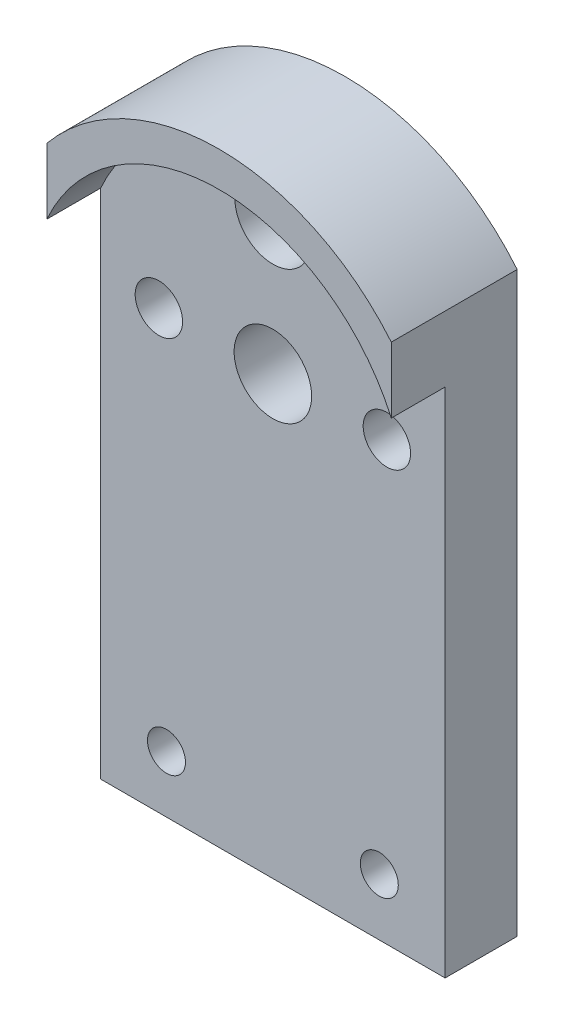
ISO-10303-21;
HEADER;
FILE_DESCRIPTION(('STEP AP214'),'2;1');
FILE_NAME('part.step','',(''),(''),'','','');
FILE_SCHEMA(('AUTOMOTIVE_DESIGN { 1 0 10303 214 1 1 1 1 }'));
ENDSEC;
DATA;
#1=APPLICATION_CONTEXT('core data for automotive mechanical design processes');
#2=APPLICATION_PROTOCOL_DEFINITION('international standard','automotive_design',2000,#1);
#3=PRODUCT_CONTEXT('',#1,'mechanical');
#4=PRODUCT('Part','Part','',(#3));
#5=PRODUCT_RELATED_PRODUCT_CATEGORY('part','',(#4));
#6=PRODUCT_DEFINITION_FORMATION('','',#4);
#7=PRODUCT_DEFINITION_CONTEXT('part definition',#1,'design');
#8=PRODUCT_DEFINITION('design','',#6,#7);
#9=PRODUCT_DEFINITION_SHAPE('','',#8);
#10=(LENGTH_UNIT() NAMED_UNIT(*) SI_UNIT(.MILLI.,.METRE.));
#11=(NAMED_UNIT(*) PLANE_ANGLE_UNIT() SI_UNIT($,.RADIAN.));
#12=(NAMED_UNIT(*) SI_UNIT($,.STERADIAN.) SOLID_ANGLE_UNIT());
#13=UNCERTAINTY_MEASURE_WITH_UNIT(LENGTH_MEASURE(1.E-05),#10,'distance_accuracy_value','');
#14=(GEOMETRIC_REPRESENTATION_CONTEXT(3) GLOBAL_UNCERTAINTY_ASSIGNED_CONTEXT((#13)) GLOBAL_UNIT_ASSIGNED_CONTEXT((#10,
#11,#12)) REPRESENTATION_CONTEXT('',''));
#15=CARTESIAN_POINT('',(0.,0.,0.));
#16=DIRECTION('',(0.,0.,1.));
#17=DIRECTION('',(1.,0.,0.));
#18=AXIS2_PLACEMENT_3D('',#15,#16,#17);
#19=CARTESIAN_POINT('',(9.525,0.,0.));
#20=DIRECTION('',(0.,0.,1.));
#21=DIRECTION('',(1.,0.,0.));
#22=AXIS2_PLACEMENT_3D('',#19,#20,#21);
#23=CYLINDRICAL_SURFACE('',#22,1.9812);
#24=CARTESIAN_POINT('',(9.525,0.,6.0198));
#25=DIRECTION('',(0.,0.,1.));
#26=DIRECTION('',(1.,0.,0.));
#27=AXIS2_PLACEMENT_3D('',#24,#25,#26);
#28=CIRCLE('',#27,1.9812);
#29=CARTESIAN_POINT('',(11.5062,0.,6.0198));
#30=VERTEX_POINT('',#29);
#31=EDGE_CURVE('E326',#30,#30,#28,.T.);
#32=ORIENTED_EDGE('',*,*,#31,.T.);
#33=EDGE_LOOP('',(#32));
#34=FACE_BOUND('',#33,.T.);
#35=CARTESIAN_POINT('',(9.525,0.,2.8448));
#36=DIRECTION('',(0.,0.,-1.));
#37=DIRECTION('',(-1.,0.,0.));
#38=AXIS2_PLACEMENT_3D('',#35,#36,#37);
#39=CIRCLE('',#38,1.9812);
#40=CARTESIAN_POINT('',(7.5438,0.,2.8448));
#41=VERTEX_POINT('',#40);
#42=EDGE_CURVE('E55',#41,#41,#39,.F.);
#43=ORIENTED_EDGE('',*,*,#42,.F.);
#44=EDGE_LOOP('',(#43));
#45=FACE_BOUND('',#44,.T.);
#46=ADVANCED_FACE('F51',(#34,#45),#23,.F.);
#47=CARTESIAN_POINT('',(-9.525,0.,0.));
#48=DIRECTION('',(0.,0.,1.));
#49=DIRECTION('',(1.,0.,0.));
#50=AXIS2_PLACEMENT_3D('',#47,#48,#49);
#51=CYLINDRICAL_SURFACE('',#50,1.9812);
#52=CARTESIAN_POINT('',(-9.525,0.,6.0198));
#53=DIRECTION('',(0.,0.,1.));
#54=DIRECTION('',(1.,0.,0.));
#55=AXIS2_PLACEMENT_3D('',#52,#53,#54);
#56=CIRCLE('',#55,1.9812);
#57=CARTESIAN_POINT('',(-7.5438,0.,6.0198));
#58=VERTEX_POINT('',#57);
#59=EDGE_CURVE('E321',#58,#58,#56,.T.);
#60=ORIENTED_EDGE('',*,*,#59,.T.);
#61=EDGE_LOOP('',(#60));
#62=FACE_BOUND('',#61,.T.);
#63=CARTESIAN_POINT('',(-9.525,0.,2.8448));
#64=DIRECTION('',(0.,0.,-1.));
#65=DIRECTION('',(-1.,0.,0.));
#66=AXIS2_PLACEMENT_3D('',#63,#64,#65);
#67=CIRCLE('',#66,1.9812);
#68=CARTESIAN_POINT('',(-11.5062,0.,2.8448));
#69=VERTEX_POINT('',#68);
#70=EDGE_CURVE('E245',#69,#69,#67,.F.);
#71=ORIENTED_EDGE('',*,*,#70,.F.);
#72=EDGE_LOOP('',(#71));
#73=FACE_BOUND('',#72,.T.);
#74=ADVANCED_FACE('F406',(#62,#73),#51,.F.);
#75=CARTESIAN_POINT('',(0.,-0.1524,6.0198));
#76=DIRECTION('',(0.,0.,-1.));
#77=DIRECTION('',(-1.,0.,0.));
#78=AXIS2_PLACEMENT_3D('',#75,#76,#77);
#79=PLANE('',#78);
#80=CARTESIAN_POINT('',(0.,11.1125,6.0198));
#81=DIRECTION('',(0.,0.,-1.));
#82=DIRECTION('',(-1.,0.,0.));
#83=AXIS2_PLACEMENT_3D('',#80,#81,#82);
#84=CIRCLE('',#83,3.175);
#85=CARTESIAN_POINT('',(-3.175,11.1125,6.0198));
#86=VERTEX_POINT('',#85);
#87=EDGE_CURVE('E678',#86,#86,#84,.T.);
#88=ORIENTED_EDGE('',*,*,#87,.T.);
#89=EDGE_LOOP('',(#88));
#90=FACE_BOUND('',#89,.T.);
#91=CARTESIAN_POINT('',(8.89,-31.75,6.0198));
#92=DIRECTION('',(0.,0.,1.));
#93=DIRECTION('',(1.,0.,0.));
#94=AXIS2_PLACEMENT_3D('',#91,#92,#93);
#95=CIRCLE('',#94,1.5875);
#96=CARTESIAN_POINT('',(10.4775,-31.75,6.0198));
#97=VERTEX_POINT('',#96);
#98=EDGE_CURVE('E695',#97,#97,#95,.T.);
#99=ORIENTED_EDGE('',*,*,#98,.F.);
#100=EDGE_LOOP('',(#99));
#101=FACE_BOUND('',#100,.T.);
#102=CARTESIAN_POINT('',(-8.88999999999999,-31.75,6.0198));
#103=DIRECTION('',(0.,0.,1.));
#104=DIRECTION('',(1.,0.,0.));
#105=AXIS2_PLACEMENT_3D('',#102,#103,#104);
#106=CIRCLE('',#105,1.5875);
#107=CARTESIAN_POINT('',(-7.30249999999999,-31.75,6.0198));
#108=VERTEX_POINT('',#107);
#109=EDGE_CURVE('E211',#108,#108,#106,.T.);
#110=ORIENTED_EDGE('',*,*,#109,.F.);
#111=EDGE_LOOP('',(#110));
#112=FACE_BOUND('',#111,.T.);
#113=ORIENTED_EDGE('',*,*,#59,.F.);
#114=EDGE_LOOP('',(#113));
#115=FACE_BOUND('',#114,.T.);
#116=ORIENTED_EDGE('',*,*,#31,.F.);
#117=EDGE_LOOP('',(#116));
#118=FACE_BOUND('',#117,.T.);
#119=CARTESIAN_POINT('',(0.,0.,6.0198));
#120=DIRECTION('',(0.,0.,1.));
#121=DIRECTION('',(1.,0.,0.));
#122=AXIS2_PLACEMENT_3D('',#119,#120,#121);
#123=CIRCLE('',#122,3.2385);
#124=CARTESIAN_POINT('',(3.2385,0.,6.0198));
#125=VERTEX_POINT('',#124);
#126=EDGE_CURVE('E357',#125,#125,#123,.T.);
#127=ORIENTED_EDGE('',*,*,#126,.F.);
#128=EDGE_LOOP('',(#127));
#129=FACE_BOUND('',#128,.T.);
#130=CARTESIAN_POINT('',(0.,-0.1524,6.0198));
#131=DIRECTION('',(0.,0.,-1.));
#132=DIRECTION('',(-1.,0.,0.));
#133=AXIS2_PLACEMENT_3D('',#130,#131,#132);
#134=CIRCLE('',#133,15.748);
#135=CARTESIAN_POINT('',(-14.3891,6.24707694659492,6.0198));
#136=VERTEX_POINT('',#135);
#137=CARTESIAN_POINT('',(14.3891,6.24707694659492,6.0198));
#138=VERTEX_POINT('',#137);
#139=EDGE_CURVE('E325',#136,#138,#134,.T.);
#140=ORIENTED_EDGE('',*,*,#139,.F.);
#141=DIRECTION('',(0.,-1.,0.));
#142=VECTOR('',#141,1.);
#143=CARTESIAN_POINT('',(-14.3891,-36.5125,6.0198));
#144=LINE('',#143,#142);
#145=CARTESIAN_POINT('',(-14.3891,-36.5125,6.0198));
#146=VERTEX_POINT('',#145);
#147=EDGE_CURVE('E368',#136,#146,#144,.T.);
#148=ORIENTED_EDGE('',*,*,#147,.T.);
#149=DIRECTION('',(1.,0.,0.));
#150=VECTOR('',#149,1.);
#151=CARTESIAN_POINT('',(14.3891,-36.5125,6.0198));
#152=LINE('',#151,#150);
#153=CARTESIAN_POINT('',(14.3891,-36.5125,6.0198));
#154=VERTEX_POINT('',#153);
#155=EDGE_CURVE('E372',#146,#154,#152,.T.);
#156=ORIENTED_EDGE('',*,*,#155,.T.);
#157=DIRECTION('',(0.,1.,0.));
#158=VECTOR('',#157,1.);
#159=CARTESIAN_POINT('',(14.3891,-36.5125,6.0198));
#160=LINE('',#159,#158);
#161=EDGE_CURVE('E365',#154,#138,#160,.T.);
#162=ORIENTED_EDGE('',*,*,#161,.T.);
#163=EDGE_LOOP('',(#140,#148,#156,#162));
#164=FACE_BOUND('',#163,.T.);
#165=ADVANCED_FACE('F412',(#90,#101,#112,#115,#118,#129,#164),#79,.F.);
#166=CARTESIAN_POINT('',(0.,-0.1524,0.));
#167=DIRECTION('',(0.,0.,-1.));
#168=DIRECTION('',(-1.,0.,0.));
#169=AXIS2_PLACEMENT_3D('',#166,#167,#168);
#170=PLANE('',#169);
#171=CARTESIAN_POINT('',(0.,11.1125,0.));
#172=DIRECTION('',(0.,0.,-1.));
#173=DIRECTION('',(-1.,0.,0.));
#174=AXIS2_PLACEMENT_3D('',#171,#172,#173);
#175=CIRCLE('',#174,3.175);
#176=CARTESIAN_POINT('',(-3.175,11.1125,0.));
#177=VERTEX_POINT('',#176);
#178=EDGE_CURVE('E675',#177,#177,#175,.T.);
#179=ORIENTED_EDGE('',*,*,#178,.F.);
#180=EDGE_LOOP('',(#179));
#181=FACE_BOUND('',#180,.T.);
#182=CARTESIAN_POINT('',(0.,-15.875,0.));
#183=DIRECTION('',(0.,0.,-1.));
#184=DIRECTION('',(-1.,0.,0.));
#185=AXIS2_PLACEMENT_3D('',#182,#183,#184);
#186=CIRCLE('',#185,3.96875);
#187=CARTESIAN_POINT('',(-3.96875,-15.875,0.));
#188=VERTEX_POINT('',#187);
#189=EDGE_CURVE('E680',#188,#188,#186,.T.);
#190=ORIENTED_EDGE('',*,*,#189,.F.);
#191=EDGE_LOOP('',(#190));
#192=FACE_BOUND('',#191,.T.);
#193=CARTESIAN_POINT('',(8.89,-31.75,0.));
#194=DIRECTION('',(0.,0.,1.));
#195=DIRECTION('',(1.,0.,0.));
#196=AXIS2_PLACEMENT_3D('',#193,#194,#195);
#197=CIRCLE('',#196,1.5875);
#198=CARTESIAN_POINT('',(10.4775,-31.75,0.));
#199=VERTEX_POINT('',#198);
#200=EDGE_CURVE('E286',#199,#199,#197,.T.);
#201=ORIENTED_EDGE('',*,*,#200,.T.);
#202=EDGE_LOOP('',(#201));
#203=FACE_BOUND('',#202,.T.);
#204=CARTESIAN_POINT('',(-8.88999999999999,-31.75,0.));
#205=DIRECTION('',(0.,0.,1.));
#206=DIRECTION('',(1.,0.,0.));
#207=AXIS2_PLACEMENT_3D('',#204,#205,#206);
#208=CIRCLE('',#207,1.5875);
#209=CARTESIAN_POINT('',(-7.30249999999999,-31.75,0.));
#210=VERTEX_POINT('',#209);
#211=EDGE_CURVE('E698',#210,#210,#208,.T.);
#212=ORIENTED_EDGE('',*,*,#211,.T.);
#213=EDGE_LOOP('',(#212));
#214=FACE_BOUND('',#213,.T.);
#215=DIRECTION('',(-0.866025403784438,-0.5,0.));
#216=VECTOR('',#215,1.);
#217=CARTESIAN_POINT('',(-6.604,-1.6864401363029,0.));
#218=LINE('',#217,#216);
#219=CARTESIAN_POINT('',(-6.604,-1.6864401363029,0.));
#220=VERTEX_POINT('',#219);
#221=CARTESIAN_POINT('',(-9.525,-3.3728802726058,0.));
#222=VERTEX_POINT('',#221);
#223=EDGE_CURVE('E69',#220,#222,#218,.T.);
#224=ORIENTED_EDGE('',*,*,#223,.F.);
#225=DIRECTION('',(0.,-1.,0.));
#226=VECTOR('',#225,1.);
#227=CARTESIAN_POINT('',(-6.604,1.68644013630289,0.));
#228=LINE('',#227,#226);
#229=CARTESIAN_POINT('',(-6.604,1.68644013630289,0.));
#230=VERTEX_POINT('',#229);
#231=EDGE_CURVE('E204',#230,#220,#228,.T.);
#232=ORIENTED_EDGE('',*,*,#231,.F.);
#233=DIRECTION('',(0.866025403784438,-0.5,0.));
#234=VECTOR('',#233,1.);
#235=CARTESIAN_POINT('',(-9.525,3.37288027260579,0.));
#236=LINE('',#235,#234);
#237=CARTESIAN_POINT('',(-9.525,3.37288027260579,0.));
#238=VERTEX_POINT('',#237);
#239=EDGE_CURVE('E208',#238,#230,#236,.T.);
#240=ORIENTED_EDGE('',*,*,#239,.F.);
#241=DIRECTION('',(0.866025403784439,0.5,0.));
#242=VECTOR('',#241,1.);
#243=CARTESIAN_POINT('',(-12.446,1.6864401363029,0.));
#244=LINE('',#243,#242);
#245=CARTESIAN_POINT('',(-12.446,1.6864401363029,0.));
#246=VERTEX_POINT('',#245);
#247=EDGE_CURVE('E235',#246,#238,#244,.T.);
#248=ORIENTED_EDGE('',*,*,#247,.F.);
#249=DIRECTION('',(0.,1.,0.));
#250=VECTOR('',#249,1.);
#251=CARTESIAN_POINT('',(-12.446,-1.6864401363029,0.));
#252=LINE('',#251,#250);
#253=CARTESIAN_POINT('',(-12.446,-1.6864401363029,0.));
#254=VERTEX_POINT('',#253);
#255=EDGE_CURVE('E231',#254,#246,#252,.T.);
#256=ORIENTED_EDGE('',*,*,#255,.F.);
#257=DIRECTION('',(-0.866025403784438,0.5,0.));
#258=VECTOR('',#257,1.);
#259=CARTESIAN_POINT('',(-9.525,-3.3728802726058,0.));
#260=LINE('',#259,#258);
#261=EDGE_CURVE('E227',#222,#254,#260,.T.);
#262=ORIENTED_EDGE('',*,*,#261,.F.);
#263=EDGE_LOOP('',(#224,#232,#240,#248,#256,#262));
#264=FACE_BOUND('',#263,.T.);
#265=DIRECTION('',(-0.866025403784439,0.5,0.));
#266=VECTOR('',#265,1.);
#267=CARTESIAN_POINT('',(9.52499999999999,-3.37288027260579,0.));
#268=LINE('',#267,#266);
#269=CARTESIAN_POINT('',(9.52499999999999,-3.37288027260579,0.));
#270=VERTEX_POINT('',#269);
#271=CARTESIAN_POINT('',(6.604,-1.6864401363029,0.));
#272=VERTEX_POINT('',#271);
#273=EDGE_CURVE('E77',#270,#272,#268,.T.);
#274=ORIENTED_EDGE('',*,*,#273,.F.);
#275=DIRECTION('',(-0.866025403784438,-0.5,0.));
#276=VECTOR('',#275,1.);
#277=CARTESIAN_POINT('',(12.446,-1.68644013630289,0.));
#278=LINE('',#277,#276);
#279=CARTESIAN_POINT('',(12.446,-1.68644013630289,0.));
#280=VERTEX_POINT('',#279);
#281=EDGE_CURVE('E262',#280,#270,#278,.T.);
#282=ORIENTED_EDGE('',*,*,#281,.F.);
#283=DIRECTION('',(0.,-1.,0.));
#284=VECTOR('',#283,1.);
#285=CARTESIAN_POINT('',(12.446,1.6864401363029,0.));
#286=LINE('',#285,#284);
#287=CARTESIAN_POINT('',(12.446,1.6864401363029,0.));
#288=VERTEX_POINT('',#287);
#289=EDGE_CURVE('E298',#288,#280,#286,.T.);
#290=ORIENTED_EDGE('',*,*,#289,.F.);
#291=DIRECTION('',(0.866025403784439,-0.5,0.));
#292=VECTOR('',#291,1.);
#293=CARTESIAN_POINT('',(9.525,3.37288027260579,0.));
#294=LINE('',#293,#292);
#295=CARTESIAN_POINT('',(9.525,3.37288027260579,0.));
#296=VERTEX_POINT('',#295);
#297=EDGE_CURVE('E294',#296,#288,#294,.T.);
#298=ORIENTED_EDGE('',*,*,#297,.F.);
#299=DIRECTION('',(0.866025403784439,0.5,0.));
#300=VECTOR('',#299,1.);
#301=CARTESIAN_POINT('',(6.604,1.6864401363029,0.));
#302=LINE('',#301,#300);
#303=CARTESIAN_POINT('',(6.604,1.6864401363029,0.));
#304=VERTEX_POINT('',#303);
#305=EDGE_CURVE('E290',#304,#296,#302,.T.);
#306=ORIENTED_EDGE('',*,*,#305,.F.);
#307=DIRECTION('',(0.,1.,0.));
#308=VECTOR('',#307,1.);
#309=CARTESIAN_POINT('',(6.604,-1.6864401363029,0.));
#310=LINE('',#309,#308);
#311=EDGE_CURVE('E285',#272,#304,#310,.T.);
#312=ORIENTED_EDGE('',*,*,#311,.F.);
#313=EDGE_LOOP('',(#274,#282,#290,#298,#306,#312));
#314=FACE_BOUND('',#313,.T.);
#315=DIRECTION('',(0.,1.,0.));
#316=VECTOR('',#315,1.);
#317=CARTESIAN_POINT('',(14.3891,-36.5125,0.));
#318=LINE('',#317,#316);
#319=CARTESIAN_POINT('',(14.3891,-36.5125,0.));
#320=VERTEX_POINT('',#319);
#321=CARTESIAN_POINT('',(14.3891,11.742361964411,0.));
#322=VERTEX_POINT('',#321);
#323=EDGE_CURVE('E361',#320,#322,#318,.T.);
#324=ORIENTED_EDGE('',*,*,#323,.F.);
#325=DIRECTION('',(1.,0.,0.));
#326=VECTOR('',#325,1.);
#327=CARTESIAN_POINT('',(14.3891,-36.5125,0.));
#328=LINE('',#327,#326);
#329=CARTESIAN_POINT('',(-14.3891,-36.5125,0.));
#330=VERTEX_POINT('',#329);
#331=EDGE_CURVE('E369',#330,#320,#328,.T.);
#332=ORIENTED_EDGE('',*,*,#331,.F.);
#333=DIRECTION('',(0.,-1.,0.));
#334=VECTOR('',#333,1.);
#335=CARTESIAN_POINT('',(-14.3891,-36.5125,0.));
#336=LINE('',#335,#334);
#337=CARTESIAN_POINT('',(-14.3891,11.742361964411,0.));
#338=VERTEX_POINT('',#337);
#339=EDGE_CURVE('E382',#338,#330,#336,.T.);
#340=ORIENTED_EDGE('',*,*,#339,.F.);
#341=CARTESIAN_POINT('',(0.,-0.1524,0.));
#342=DIRECTION('',(0.,0.,1.));
#343=DIRECTION('',(-1.,0.,0.));
#344=AXIS2_PLACEMENT_3D('',#341,#342,#343);
#345=CIRCLE('',#344,18.669);
#346=EDGE_CURVE('E379',#322,#338,#345,.T.);
#347=ORIENTED_EDGE('',*,*,#346,.F.);
#348=EDGE_LOOP('',(#324,#332,#340,#347));
#349=FACE_BOUND('',#348,.T.);
#350=CARTESIAN_POINT('',(0.,0.,0.));
#351=DIRECTION('',(0.,0.,1.));
#352=DIRECTION('',(1.,0.,0.));
#353=AXIS2_PLACEMENT_3D('',#350,#351,#352);
#354=CIRCLE('',#353,3.2385);
#355=CARTESIAN_POINT('',(3.2385,0.,0.));
#356=VERTEX_POINT('',#355);
#357=EDGE_CURVE('E356',#356,#356,#354,.T.);
#358=ORIENTED_EDGE('',*,*,#357,.T.);
#359=EDGE_LOOP('',(#358));
#360=FACE_BOUND('',#359,.T.);
#361=ADVANCED_FACE('F432',(#181,#192,#203,#214,#264,#314,#349,#360),#170,.T.);
#362=CARTESIAN_POINT('',(14.3891,-36.5125,6.0198));
#363=DIRECTION('',(-1.,0.,0.));
#364=DIRECTION('',(0.,-1.,0.));
#365=AXIS2_PLACEMENT_3D('',#362,#363,#364);
#366=PLANE('',#365);
#367=ORIENTED_EDGE('',*,*,#323,.T.);
#368=DIRECTION('',(0.,0.,-1.));
#369=VECTOR('',#368,1.);
#370=CARTESIAN_POINT('',(14.3891,11.742361964411,6.0198));
#371=LINE('',#370,#369);
#372=CARTESIAN_POINT('',(14.3891,11.742361964411,10.5156));
#373=VERTEX_POINT('',#372);
#374=EDGE_CURVE('E12',#373,#322,#371,.T.);
#375=ORIENTED_EDGE('',*,*,#374,.F.);
#376=DIRECTION('',(0.,1.,0.));
#377=VECTOR('',#376,1.);
#378=CARTESIAN_POINT('',(14.3891,11.742361964411,10.5156));
#379=LINE('',#378,#377);
#380=CARTESIAN_POINT('',(14.3891,6.24707694659492,10.5156));
#381=VERTEX_POINT('',#380);
#382=EDGE_CURVE('E334',#381,#373,#379,.T.);
#383=ORIENTED_EDGE('',*,*,#382,.F.);
#384=DIRECTION('',(0.,0.,-1.));
#385=VECTOR('',#384,1.);
#386=CARTESIAN_POINT('',(14.3891,6.24707694659492,10.5156));
#387=LINE('',#386,#385);
#388=EDGE_CURVE('E352',#381,#138,#387,.T.);
#389=ORIENTED_EDGE('',*,*,#388,.T.);
#390=ORIENTED_EDGE('',*,*,#161,.F.);
#391=DIRECTION('',(0.,0.,-1.));
#392=VECTOR('',#391,1.);
#393=CARTESIAN_POINT('',(14.3891,-36.5125,6.0198));
#394=LINE('',#393,#392);
#395=EDGE_CURVE('E375',#154,#320,#394,.T.);
#396=ORIENTED_EDGE('',*,*,#395,.T.);
#397=EDGE_LOOP('',(#367,#375,#383,#389,#390,#396));
#398=FACE_BOUND('',#397,.T.);
#399=ADVANCED_FACE('F53',(#398),#366,.F.);
#400=CARTESIAN_POINT('',(0.,-0.1524,6.0198));
#401=DIRECTION('',(0.,0.,-1.));
#402=DIRECTION('',(-1.,0.,0.));
#403=AXIS2_PLACEMENT_3D('',#400,#401,#402);
#404=CYLINDRICAL_SURFACE('',#403,18.669);
#405=ORIENTED_EDGE('',*,*,#346,.T.);
#406=DIRECTION('',(0.,0.,-1.));
#407=VECTOR('',#406,1.);
#408=CARTESIAN_POINT('',(-14.3891,11.742361964411,6.0198));
#409=LINE('',#408,#407);
#410=CARTESIAN_POINT('',(-14.3891,11.742361964411,10.5156));
#411=VERTEX_POINT('',#410);
#412=EDGE_CURVE('E61',#411,#338,#409,.T.);
#413=ORIENTED_EDGE('',*,*,#412,.F.);
#414=CARTESIAN_POINT('',(0.,-0.1524,10.5156));
#415=DIRECTION('',(0.,0.,1.));
#416=DIRECTION('',(-1.,0.,0.));
#417=AXIS2_PLACEMENT_3D('',#414,#415,#416);
#418=CIRCLE('',#417,18.669);
#419=EDGE_CURVE('E338',#373,#411,#418,.T.);
#420=ORIENTED_EDGE('',*,*,#419,.F.);
#421=ORIENTED_EDGE('',*,*,#374,.T.);
#422=EDGE_LOOP('',(#405,#413,#420,#421));
#423=FACE_BOUND('',#422,.T.);
#424=ADVANCED_FACE('F442',(#423),#404,.T.);
#425=CARTESIAN_POINT('',(-14.3891,-36.5125,6.0198));
#426=DIRECTION('',(1.,0.,0.));
#427=DIRECTION('',(0.,1.,0.));
#428=AXIS2_PLACEMENT_3D('',#425,#426,#427);
#429=PLANE('',#428);
#430=ORIENTED_EDGE('',*,*,#339,.T.);
#431=DIRECTION('',(0.,0.,-1.));
#432=VECTOR('',#431,1.);
#433=CARTESIAN_POINT('',(-14.3891,-36.5125,6.0198));
#434=LINE('',#433,#432);
#435=EDGE_CURVE('E390',#146,#330,#434,.T.);
#436=ORIENTED_EDGE('',*,*,#435,.F.);
#437=ORIENTED_EDGE('',*,*,#147,.F.);
#438=DIRECTION('',(0.,0.,-1.));
#439=VECTOR('',#438,1.);
#440=CARTESIAN_POINT('',(-14.3891,6.24707694659492,10.5156));
#441=LINE('',#440,#439);
#442=CARTESIAN_POINT('',(-14.3891,6.24707694659492,10.5156));
#443=VERTEX_POINT('',#442);
#444=EDGE_CURVE('E345',#443,#136,#441,.T.);
#445=ORIENTED_EDGE('',*,*,#444,.F.);
#446=DIRECTION('',(0.,-1.,0.));
#447=VECTOR('',#446,1.);
#448=CARTESIAN_POINT('',(-14.3891,6.24707694659492,10.5156));
#449=LINE('',#448,#447);
#450=EDGE_CURVE('E342',#411,#443,#449,.T.);
#451=ORIENTED_EDGE('',*,*,#450,.F.);
#452=ORIENTED_EDGE('',*,*,#412,.T.);
#453=EDGE_LOOP('',(#430,#436,#437,#445,#451,#452));
#454=FACE_BOUND('',#453,.T.);
#455=ADVANCED_FACE('F439',(#454),#429,.F.);
#456=CARTESIAN_POINT('',(14.3891,-36.5125,6.0198));
#457=DIRECTION('',(0.,1.,0.));
#458=DIRECTION('',(-1.,0.,0.));
#459=AXIS2_PLACEMENT_3D('',#456,#457,#458);
#460=PLANE('',#459);
#461=ORIENTED_EDGE('',*,*,#331,.T.);
#462=ORIENTED_EDGE('',*,*,#395,.F.);
#463=ORIENTED_EDGE('',*,*,#155,.F.);
#464=ORIENTED_EDGE('',*,*,#435,.T.);
#465=EDGE_LOOP('',(#461,#462,#463,#464));
#466=FACE_BOUND('',#465,.T.);
#467=ADVANCED_FACE('F428',(#466),#460,.F.);
#468=CARTESIAN_POINT('',(0.,0.,6.0198));
#469=DIRECTION('',(0.,0.,-1.));
#470=DIRECTION('',(-1.,0.,0.));
#471=AXIS2_PLACEMENT_3D('',#468,#469,#470);
#472=CYLINDRICAL_SURFACE('',#471,3.2385);
#473=ORIENTED_EDGE('',*,*,#126,.T.);
#474=EDGE_LOOP('',(#473));
#475=FACE_BOUND('',#474,.T.);
#476=ORIENTED_EDGE('',*,*,#357,.F.);
#477=EDGE_LOOP('',(#476));
#478=FACE_BOUND('',#477,.T.);
#479=ADVANCED_FACE('F424',(#475,#478),#472,.F.);
#480=CARTESIAN_POINT('',(0.,-0.1524,10.5156));
#481=DIRECTION('',(0.,0.,-1.));
#482=DIRECTION('',(-1.,0.,0.));
#483=AXIS2_PLACEMENT_3D('',#480,#481,#482);
#484=CYLINDRICAL_SURFACE('',#483,15.748);
#485=ORIENTED_EDGE('',*,*,#139,.T.);
#486=ORIENTED_EDGE('',*,*,#388,.F.);
#487=CARTESIAN_POINT('',(0.,-0.1524,10.5156));
#488=DIRECTION('',(0.,0.,-1.));
#489=DIRECTION('',(-1.,0.,0.));
#490=AXIS2_PLACEMENT_3D('',#487,#488,#489);
#491=CIRCLE('',#490,15.748);
#492=EDGE_CURVE('E330',#443,#381,#491,.T.);
#493=ORIENTED_EDGE('',*,*,#492,.F.);
#494=ORIENTED_EDGE('',*,*,#444,.T.);
#495=EDGE_LOOP('',(#485,#486,#493,#494));
#496=FACE_BOUND('',#495,.T.);
#497=ADVANCED_FACE('F420',(#496),#484,.F.);
#498=CARTESIAN_POINT('',(0.,-0.1524,10.5156));
#499=DIRECTION('',(0.,0.,-1.));
#500=DIRECTION('',(-1.,0.,0.));
#501=AXIS2_PLACEMENT_3D('',#498,#499,#500);
#502=PLANE('',#501);
#503=ORIENTED_EDGE('',*,*,#492,.T.);
#504=ORIENTED_EDGE('',*,*,#382,.T.);
#505=ORIENTED_EDGE('',*,*,#419,.T.);
#506=ORIENTED_EDGE('',*,*,#450,.T.);
#507=EDGE_LOOP('',(#503,#504,#505,#506));
#508=FACE_BOUND('',#507,.T.);
#509=ADVANCED_FACE('F417',(#508),#502,.F.);
#510=CARTESIAN_POINT('',(0.,0.,2.8448));
#511=DIRECTION('',(0.,0.,-1.));
#512=DIRECTION('',(-1.,0.,0.));
#513=AXIS2_PLACEMENT_3D('',#510,#511,#512);
#514=PLANE('',#513);
#515=DIRECTION('',(-0.866025403784438,-0.5,0.));
#516=VECTOR('',#515,1.);
#517=CARTESIAN_POINT('',(-6.604,-1.6864401363029,2.8448));
#518=LINE('',#517,#516);
#519=CARTESIAN_POINT('',(-6.604,-1.6864401363029,2.8448));
#520=VERTEX_POINT('',#519);
#521=CARTESIAN_POINT('',(-9.525,-3.3728802726058,2.8448));
#522=VERTEX_POINT('',#521);
#523=EDGE_CURVE('E181',#520,#522,#518,.T.);
#524=ORIENTED_EDGE('',*,*,#523,.T.);
#525=DIRECTION('',(-0.866025403784438,0.5,0.));
#526=VECTOR('',#525,1.);
#527=CARTESIAN_POINT('',(-9.525,-3.3728802726058,2.8448));
#528=LINE('',#527,#526);
#529=CARTESIAN_POINT('',(-12.446,-1.6864401363029,2.8448));
#530=VERTEX_POINT('',#529);
#531=EDGE_CURVE('E191',#522,#530,#528,.T.);
#532=ORIENTED_EDGE('',*,*,#531,.T.);
#533=DIRECTION('',(0.,1.,0.));
#534=VECTOR('',#533,1.);
#535=CARTESIAN_POINT('',(-12.446,-1.6864401363029,2.8448));
#536=LINE('',#535,#534);
#537=CARTESIAN_POINT('',(-12.446,1.6864401363029,2.8448));
#538=VERTEX_POINT('',#537);
#539=EDGE_CURVE('E197',#530,#538,#536,.T.);
#540=ORIENTED_EDGE('',*,*,#539,.T.);
#541=DIRECTION('',(0.866025403784439,0.5,0.));
#542=VECTOR('',#541,1.);
#543=CARTESIAN_POINT('',(-12.446,1.6864401363029,2.8448));
#544=LINE('',#543,#542);
#545=CARTESIAN_POINT('',(-9.525,3.37288027260579,2.8448));
#546=VERTEX_POINT('',#545);
#547=EDGE_CURVE('E216',#538,#546,#544,.T.);
#548=ORIENTED_EDGE('',*,*,#547,.T.);
#549=DIRECTION('',(0.866025403784438,-0.5,0.));
#550=VECTOR('',#549,1.);
#551=CARTESIAN_POINT('',(-9.525,3.37288027260579,2.8448));
#552=LINE('',#551,#550);
#553=CARTESIAN_POINT('',(-6.604,1.68644013630289,2.8448));
#554=VERTEX_POINT('',#553);
#555=EDGE_CURVE('E220',#546,#554,#552,.T.);
#556=ORIENTED_EDGE('',*,*,#555,.T.);
#557=DIRECTION('',(0.,-1.,0.));
#558=VECTOR('',#557,1.);
#559=CARTESIAN_POINT('',(-6.604,1.68644013630289,2.8448));
#560=LINE('',#559,#558);
#561=EDGE_CURVE('E188',#554,#520,#560,.T.);
#562=ORIENTED_EDGE('',*,*,#561,.T.);
#563=EDGE_LOOP('',(#524,#532,#540,#548,#556,#562));
#564=FACE_BOUND('',#563,.T.);
#565=ORIENTED_EDGE('',*,*,#70,.T.);
#566=EDGE_LOOP('',(#565));
#567=FACE_BOUND('',#566,.T.);
#568=ADVANCED_FACE('F199',(#564,#567),#514,.T.);
#569=CARTESIAN_POINT('',(-6.604,-1.6864401363029,2.8448));
#570=DIRECTION('',(0.5,-0.866025403784439,0.));
#571=DIRECTION('',(0.866025403784439,0.5,0.));
#572=AXIS2_PLACEMENT_3D('',#569,#570,#571);
#573=PLANE('',#572);
#574=ORIENTED_EDGE('',*,*,#223,.T.);
#575=DIRECTION('',(0.,0.,-1.));
#576=VECTOR('',#575,1.);
#577=CARTESIAN_POINT('',(-9.525,-3.3728802726058,2.8448));
#578=LINE('',#577,#576);
#579=EDGE_CURVE('E177',#522,#222,#578,.T.);
#580=ORIENTED_EDGE('',*,*,#579,.F.);
#581=ORIENTED_EDGE('',*,*,#523,.F.);
#582=DIRECTION('',(0.,0.,-1.));
#583=VECTOR('',#582,1.);
#584=CARTESIAN_POINT('',(-6.604,-1.6864401363029,2.8448));
#585=LINE('',#584,#583);
#586=EDGE_CURVE('E242',#520,#220,#585,.T.);
#587=ORIENTED_EDGE('',*,*,#586,.T.);
#588=EDGE_LOOP('',(#574,#580,#581,#587));
#589=FACE_BOUND('',#588,.T.);
#590=ADVANCED_FACE('F179',(#589),#573,.F.);
#591=CARTESIAN_POINT('',(-6.604,1.68644013630289,2.8448));
#592=DIRECTION('',(1.,0.,0.));
#593=DIRECTION('',(0.,1.,0.));
#594=AXIS2_PLACEMENT_3D('',#591,#592,#593);
#595=PLANE('',#594);
#596=ORIENTED_EDGE('',*,*,#231,.T.);
#597=ORIENTED_EDGE('',*,*,#586,.F.);
#598=ORIENTED_EDGE('',*,*,#561,.F.);
#599=DIRECTION('',(0.,0.,-1.));
#600=VECTOR('',#599,1.);
#601=CARTESIAN_POINT('',(-6.604,1.68644013630289,2.8448));
#602=LINE('',#601,#600);
#603=EDGE_CURVE('E246',#554,#230,#602,.T.);
#604=ORIENTED_EDGE('',*,*,#603,.T.);
#605=EDGE_LOOP('',(#596,#597,#598,#604));
#606=FACE_BOUND('',#605,.T.);
#607=ADVANCED_FACE('F506',(#606),#595,.F.);
#608=CARTESIAN_POINT('',(-9.525,3.37288027260579,2.8448));
#609=DIRECTION('',(0.5,0.866025403784439,0.));
#610=DIRECTION('',(-0.866025403784439,0.5,0.));
#611=AXIS2_PLACEMENT_3D('',#608,#609,#610);
#612=PLANE('',#611);
#613=ORIENTED_EDGE('',*,*,#239,.T.);
#614=ORIENTED_EDGE('',*,*,#603,.F.);
#615=ORIENTED_EDGE('',*,*,#555,.F.);
#616=DIRECTION('',(0.,0.,-1.));
#617=VECTOR('',#616,1.);
#618=CARTESIAN_POINT('',(-9.525,3.37288027260579,2.8448));
#619=LINE('',#618,#617);
#620=EDGE_CURVE('E249',#546,#238,#619,.T.);
#621=ORIENTED_EDGE('',*,*,#620,.T.);
#622=EDGE_LOOP('',(#613,#614,#615,#621));
#623=FACE_BOUND('',#622,.T.);
#624=ADVANCED_FACE('F515',(#623),#612,.F.);
#625=CARTESIAN_POINT('',(-12.446,1.6864401363029,2.8448));
#626=DIRECTION('',(-0.5,0.866025403784439,0.));
#627=DIRECTION('',(-0.866025403784439,-0.5,0.));
#628=AXIS2_PLACEMENT_3D('',#625,#626,#627);
#629=PLANE('',#628);
#630=ORIENTED_EDGE('',*,*,#247,.T.);
#631=ORIENTED_EDGE('',*,*,#620,.F.);
#632=ORIENTED_EDGE('',*,*,#547,.F.);
#633=DIRECTION('',(0.,0.,-1.));
#634=VECTOR('',#633,1.);
#635=CARTESIAN_POINT('',(-12.446,1.6864401363029,2.8448));
#636=LINE('',#635,#634);
#637=EDGE_CURVE('E252',#538,#246,#636,.T.);
#638=ORIENTED_EDGE('',*,*,#637,.T.);
#639=EDGE_LOOP('',(#630,#631,#632,#638));
#640=FACE_BOUND('',#639,.T.);
#641=ADVANCED_FACE('F525',(#640),#629,.F.);
#642=CARTESIAN_POINT('',(-12.446,-1.6864401363029,2.8448));
#643=DIRECTION('',(-1.,0.,0.));
#644=DIRECTION('',(0.,0.,1.));
#645=AXIS2_PLACEMENT_3D('',#642,#643,#644);
#646=PLANE('',#645);
#647=ORIENTED_EDGE('',*,*,#255,.T.);
#648=ORIENTED_EDGE('',*,*,#637,.F.);
#649=ORIENTED_EDGE('',*,*,#539,.F.);
#650=DIRECTION('',(0.,0.,-1.));
#651=VECTOR('',#650,1.);
#652=CARTESIAN_POINT('',(-12.446,-1.6864401363029,2.8448));
#653=LINE('',#652,#651);
#654=EDGE_CURVE('E187',#530,#254,#653,.T.);
#655=ORIENTED_EDGE('',*,*,#654,.T.);
#656=EDGE_LOOP('',(#647,#648,#649,#655));
#657=FACE_BOUND('',#656,.T.);
#658=ADVANCED_FACE('F535',(#657),#646,.F.);
#659=CARTESIAN_POINT('',(-9.525,-3.3728802726058,2.8448));
#660=DIRECTION('',(-0.5,-0.866025403784439,0.));
#661=DIRECTION('',(0.866025403784439,-0.5,0.));
#662=AXIS2_PLACEMENT_3D('',#659,#660,#661);
#663=PLANE('',#662);
#664=ORIENTED_EDGE('',*,*,#261,.T.);
#665=ORIENTED_EDGE('',*,*,#654,.F.);
#666=ORIENTED_EDGE('',*,*,#531,.F.);
#667=ORIENTED_EDGE('',*,*,#579,.T.);
#668=EDGE_LOOP('',(#664,#665,#666,#667));
#669=FACE_BOUND('',#668,.T.);
#670=ADVANCED_FACE('F192',(#669),#663,.F.);
#671=CARTESIAN_POINT('',(0.,0.,2.8448));
#672=DIRECTION('',(0.,0.,-1.));
#673=DIRECTION('',(-1.,0.,0.));
#674=AXIS2_PLACEMENT_3D('',#671,#672,#673);
#675=PLANE('',#674);
#676=DIRECTION('',(-0.866025403784439,0.5,0.));
#677=VECTOR('',#676,1.);
#678=CARTESIAN_POINT('',(9.52499999999999,-3.37288027260579,2.8448));
#679=LINE('',#678,#677);
#680=CARTESIAN_POINT('',(9.52499999999999,-3.37288027260579,2.8448));
#681=VERTEX_POINT('',#680);
#682=CARTESIAN_POINT('',(6.604,-1.6864401363029,2.8448));
#683=VERTEX_POINT('',#682);
#684=EDGE_CURVE('E257',#681,#683,#679,.T.);
#685=ORIENTED_EDGE('',*,*,#684,.T.);
#686=DIRECTION('',(0.,1.,0.));
#687=VECTOR('',#686,1.);
#688=CARTESIAN_POINT('',(6.604,-1.6864401363029,2.8448));
#689=LINE('',#688,#687);
#690=CARTESIAN_POINT('',(6.604,1.6864401363029,2.8448));
#691=VERTEX_POINT('',#690);
#692=EDGE_CURVE('E261',#683,#691,#689,.T.);
#693=ORIENTED_EDGE('',*,*,#692,.T.);
#694=DIRECTION('',(0.866025403784439,0.5,0.));
#695=VECTOR('',#694,1.);
#696=CARTESIAN_POINT('',(6.604,1.6864401363029,2.8448));
#697=LINE('',#696,#695);
#698=CARTESIAN_POINT('',(9.525,3.37288027260579,2.8448));
#699=VERTEX_POINT('',#698);
#700=EDGE_CURVE('E266',#691,#699,#697,.T.);
#701=ORIENTED_EDGE('',*,*,#700,.T.);
#702=DIRECTION('',(0.866025403784439,-0.5,0.));
#703=VECTOR('',#702,1.);
#704=CARTESIAN_POINT('',(9.525,3.37288027260579,2.8448));
#705=LINE('',#704,#703);
#706=CARTESIAN_POINT('',(12.446,1.6864401363029,2.8448));
#707=VERTEX_POINT('',#706);
#708=EDGE_CURVE('E270',#699,#707,#705,.T.);
#709=ORIENTED_EDGE('',*,*,#708,.T.);
#710=DIRECTION('',(0.,-1.,0.));
#711=VECTOR('',#710,1.);
#712=CARTESIAN_POINT('',(12.446,1.6864401363029,2.8448));
#713=LINE('',#712,#711);
#714=CARTESIAN_POINT('',(12.446,-1.68644013630289,2.8448));
#715=VERTEX_POINT('',#714);
#716=EDGE_CURVE('E274',#707,#715,#713,.T.);
#717=ORIENTED_EDGE('',*,*,#716,.T.);
#718=DIRECTION('',(-0.866025403784438,-0.5,0.));
#719=VECTOR('',#718,1.);
#720=CARTESIAN_POINT('',(12.446,-1.68644013630289,2.8448));
#721=LINE('',#720,#719);
#722=EDGE_CURVE('E278',#715,#681,#721,.T.);
#723=ORIENTED_EDGE('',*,*,#722,.T.);
#724=EDGE_LOOP('',(#685,#693,#701,#709,#717,#723));
#725=FACE_BOUND('',#724,.T.);
#726=ORIENTED_EDGE('',*,*,#42,.T.);
#727=EDGE_LOOP('',(#726));
#728=FACE_BOUND('',#727,.T.);
#729=ADVANCED_FACE('F403',(#725,#728),#675,.T.);
#730=CARTESIAN_POINT('',(9.52499999999999,-3.37288027260579,2.8448));
#731=DIRECTION('',(-0.5,-0.866025403784439,0.));
#732=DIRECTION('',(0.866025403784439,-0.5,0.));
#733=AXIS2_PLACEMENT_3D('',#730,#731,#732);
#734=PLANE('',#733);
#735=ORIENTED_EDGE('',*,*,#273,.T.);
#736=DIRECTION('',(0.,0.,-1.));
#737=VECTOR('',#736,1.);
#738=CARTESIAN_POINT('',(6.604,-1.6864401363029,2.8448));
#739=LINE('',#738,#737);
#740=EDGE_CURVE('E282',#683,#272,#739,.T.);
#741=ORIENTED_EDGE('',*,*,#740,.F.);
#742=ORIENTED_EDGE('',*,*,#684,.F.);
#743=DIRECTION('',(0.,0.,-1.));
#744=VECTOR('',#743,1.);
#745=CARTESIAN_POINT('',(9.52499999999999,-3.37288027260579,2.8448));
#746=LINE('',#745,#744);
#747=EDGE_CURVE('E228',#681,#270,#746,.T.);
#748=ORIENTED_EDGE('',*,*,#747,.T.);
#749=EDGE_LOOP('',(#735,#741,#742,#748));
#750=FACE_BOUND('',#749,.T.);
#751=ADVANCED_FACE('F562',(#750),#734,.F.);
#752=CARTESIAN_POINT('',(12.446,-1.68644013630289,2.8448));
#753=DIRECTION('',(0.5,-0.866025403784439,0.));
#754=DIRECTION('',(0.866025403784439,0.5,0.));
#755=AXIS2_PLACEMENT_3D('',#752,#753,#754);
#756=PLANE('',#755);
#757=ORIENTED_EDGE('',*,*,#281,.T.);
#758=ORIENTED_EDGE('',*,*,#747,.F.);
#759=ORIENTED_EDGE('',*,*,#722,.F.);
#760=DIRECTION('',(0.,0.,-1.));
#761=VECTOR('',#760,1.);
#762=CARTESIAN_POINT('',(12.446,-1.68644013630289,2.8448));
#763=LINE('',#762,#761);
#764=EDGE_CURVE('E307',#715,#280,#763,.T.);
#765=ORIENTED_EDGE('',*,*,#764,.T.);
#766=EDGE_LOOP('',(#757,#758,#759,#765));
#767=FACE_BOUND('',#766,.T.);
#768=ADVANCED_FACE('F572',(#767),#756,.F.);
#769=CARTESIAN_POINT('',(12.446,1.6864401363029,2.8448));
#770=DIRECTION('',(1.,0.,0.));
#771=DIRECTION('',(0.,0.,-1.));
#772=AXIS2_PLACEMENT_3D('',#769,#770,#771);
#773=PLANE('',#772);
#774=ORIENTED_EDGE('',*,*,#289,.T.);
#775=ORIENTED_EDGE('',*,*,#764,.F.);
#776=ORIENTED_EDGE('',*,*,#716,.F.);
#777=DIRECTION('',(0.,0.,-1.));
#778=VECTOR('',#777,1.);
#779=CARTESIAN_POINT('',(12.446,1.6864401363029,2.8448));
#780=LINE('',#779,#778);
#781=EDGE_CURVE('E310',#707,#288,#780,.T.);
#782=ORIENTED_EDGE('',*,*,#781,.T.);
#783=EDGE_LOOP('',(#774,#775,#776,#782));
#784=FACE_BOUND('',#783,.T.);
#785=ADVANCED_FACE('F580',(#784),#773,.F.);
#786=CARTESIAN_POINT('',(9.525,3.37288027260579,2.8448));
#787=DIRECTION('',(0.5,0.866025403784439,0.));
#788=DIRECTION('',(-0.866025403784439,0.5,0.));
#789=AXIS2_PLACEMENT_3D('',#786,#787,#788);
#790=PLANE('',#789);
#791=ORIENTED_EDGE('',*,*,#297,.T.);
#792=ORIENTED_EDGE('',*,*,#781,.F.);
#793=ORIENTED_EDGE('',*,*,#708,.F.);
#794=DIRECTION('',(0.,0.,-1.));
#795=VECTOR('',#794,1.);
#796=CARTESIAN_POINT('',(9.525,3.37288027260579,2.8448));
#797=LINE('',#796,#795);
#798=EDGE_CURVE('E313',#699,#296,#797,.T.);
#799=ORIENTED_EDGE('',*,*,#798,.T.);
#800=EDGE_LOOP('',(#791,#792,#793,#799));
#801=FACE_BOUND('',#800,.T.);
#802=ADVANCED_FACE('F590',(#801),#790,.F.);
#803=CARTESIAN_POINT('',(6.604,1.6864401363029,2.8448));
#804=DIRECTION('',(-0.5,0.866025403784439,0.));
#805=DIRECTION('',(-0.866025403784439,-0.5,0.));
#806=AXIS2_PLACEMENT_3D('',#803,#804,#805);
#807=PLANE('',#806);
#808=ORIENTED_EDGE('',*,*,#305,.T.);
#809=ORIENTED_EDGE('',*,*,#798,.F.);
#810=ORIENTED_EDGE('',*,*,#700,.F.);
#811=DIRECTION('',(0.,0.,-1.));
#812=VECTOR('',#811,1.);
#813=CARTESIAN_POINT('',(6.604,1.6864401363029,2.8448));
#814=LINE('',#813,#812);
#815=EDGE_CURVE('E316',#691,#304,#814,.T.);
#816=ORIENTED_EDGE('',*,*,#815,.T.);
#817=EDGE_LOOP('',(#808,#809,#810,#816));
#818=FACE_BOUND('',#817,.T.);
#819=ADVANCED_FACE('F600',(#818),#807,.F.);
#820=CARTESIAN_POINT('',(6.604,-1.6864401363029,2.8448));
#821=DIRECTION('',(-1.,0.,0.));
#822=DIRECTION('',(0.,-1.,0.));
#823=AXIS2_PLACEMENT_3D('',#820,#821,#822);
#824=PLANE('',#823);
#825=ORIENTED_EDGE('',*,*,#311,.T.);
#826=ORIENTED_EDGE('',*,*,#815,.F.);
#827=ORIENTED_EDGE('',*,*,#692,.F.);
#828=ORIENTED_EDGE('',*,*,#740,.T.);
#829=EDGE_LOOP('',(#825,#826,#827,#828));
#830=FACE_BOUND('',#829,.T.);
#831=ADVANCED_FACE('F610',(#830),#824,.F.);
#832=CARTESIAN_POINT('',(-8.88999999999999,-31.75,0.));
#833=DIRECTION('',(0.,0.,1.));
#834=DIRECTION('',(1.,0.,0.));
#835=AXIS2_PLACEMENT_3D('',#832,#833,#834);
#836=CYLINDRICAL_SURFACE('',#835,1.5875);
#837=ORIENTED_EDGE('',*,*,#211,.F.);
#838=EDGE_LOOP('',(#837));
#839=FACE_BOUND('',#838,.T.);
#840=ORIENTED_EDGE('',*,*,#109,.T.);
#841=EDGE_LOOP('',(#840));
#842=FACE_BOUND('',#841,.T.);
#843=ADVANCED_FACE('F620',(#839,#842),#836,.F.);
#844=CARTESIAN_POINT('',(8.89,-31.75,0.));
#845=DIRECTION('',(0.,0.,1.));
#846=DIRECTION('',(1.,0.,0.));
#847=AXIS2_PLACEMENT_3D('',#844,#845,#846);
#848=CYLINDRICAL_SURFACE('',#847,1.5875);
#849=ORIENTED_EDGE('',*,*,#200,.F.);
#850=EDGE_LOOP('',(#849));
#851=FACE_BOUND('',#850,.T.);
#852=ORIENTED_EDGE('',*,*,#98,.T.);
#853=EDGE_LOOP('',(#852));
#854=FACE_BOUND('',#853,.T.);
#855=ADVANCED_FACE('F630',(#851,#854),#848,.F.);
#856=CARTESIAN_POINT('',(0.,-15.875,-3.175));
#857=DIRECTION('',(0.,0.,1.));
#858=DIRECTION('',(1.,0.,0.));
#859=AXIS2_PLACEMENT_3D('',#856,#857,#858);
#860=CYLINDRICAL_SURFACE('',#859,3.96875);
#861=CARTESIAN_POINT('',(0.,-15.875,-3.175));
#862=DIRECTION('',(0.,0.,-1.));
#863=DIRECTION('',(-1.,0.,0.));
#864=AXIS2_PLACEMENT_3D('',#861,#862,#863);
#865=CIRCLE('',#864,3.96875);
#866=CARTESIAN_POINT('',(-3.96875,-15.875,-3.175));
#867=VERTEX_POINT('',#866);
#868=EDGE_CURVE('E685',#867,#867,#865,.T.);
#869=ORIENTED_EDGE('',*,*,#868,.F.);
#870=EDGE_LOOP('',(#869));
#871=FACE_BOUND('',#870,.T.);
#872=ORIENTED_EDGE('',*,*,#189,.T.);
#873=EDGE_LOOP('',(#872));
#874=FACE_BOUND('',#873,.T.);
#875=ADVANCED_FACE('F640',(#871,#874),#860,.T.);
#876=CARTESIAN_POINT('',(0.,-15.875,-3.175));
#877=DIRECTION('',(0.,0.,-1.));
#878=DIRECTION('',(-1.,0.,0.));
#879=AXIS2_PLACEMENT_3D('',#876,#877,#878);
#880=PLANE('',#879);
#881=ORIENTED_EDGE('',*,*,#868,.T.);
#882=EDGE_LOOP('',(#881));
#883=FACE_BOUND('',#882,.T.);
#884=ADVANCED_FACE('F649',(#883),#880,.T.);
#885=CARTESIAN_POINT('',(0.,11.1125,10.5156));
#886=DIRECTION('',(0.,0.,-1.));
#887=DIRECTION('',(-1.,0.,0.));
#888=AXIS2_PLACEMENT_3D('',#885,#886,#887);
#889=CYLINDRICAL_SURFACE('',#888,3.175);
#890=ORIENTED_EDGE('',*,*,#178,.T.);
#891=EDGE_LOOP('',(#890));
#892=FACE_BOUND('',#891,.T.);
#893=ORIENTED_EDGE('',*,*,#87,.F.);
#894=EDGE_LOOP('',(#893));
#895=FACE_BOUND('',#894,.T.);
#896=ADVANCED_FACE('F658',(#892,#895),#889,.F.);
#897=CLOSED_SHELL('',(#46,#74,#165,#361,#399,#424,#455,#467,#479,#497,#509,#568,#590,#607,#624,
#641,#658,#670,#729,#751,#768,#785,#802,#819,#831,#843,#855,#875,#884,#896));
#898=MANIFOLD_SOLID_BREP('B2',#897);
#899=ADVANCED_BREP_SHAPE_REPRESENTATION('',(#18,#898),#14);
#900=SHAPE_DEFINITION_REPRESENTATION(#9,#899);
ENDSEC;
END-ISO-10303-21;
